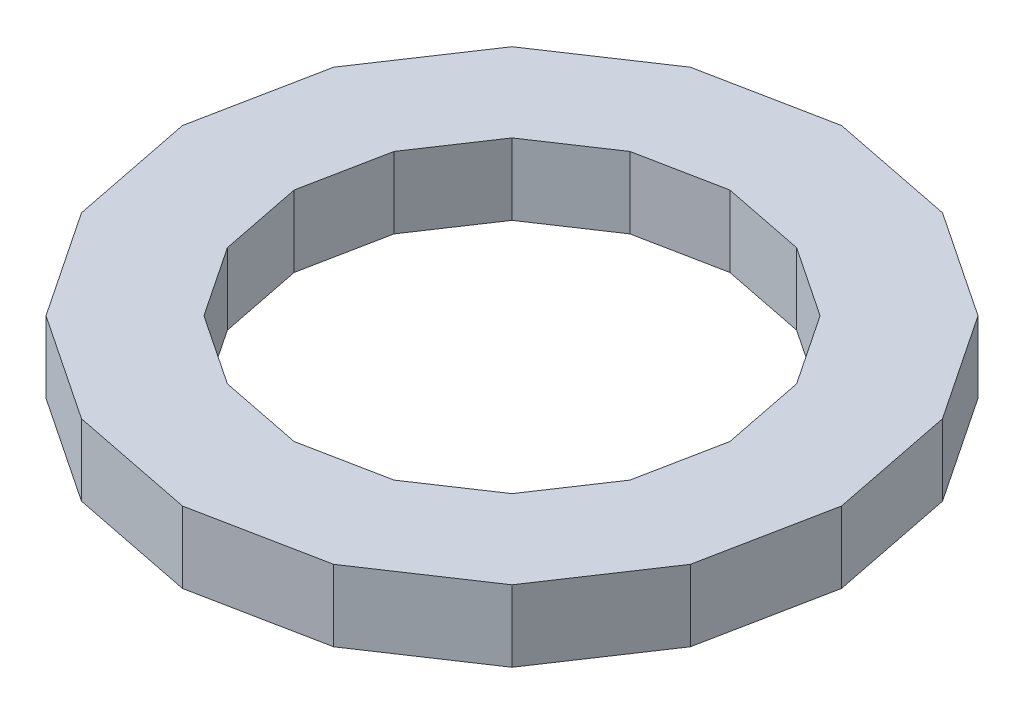
ISO-10303-21;
HEADER;
FILE_DESCRIPTION(('STEP AP214'),'2;1');
FILE_NAME('part.step','',(''),(''),'','','');
FILE_SCHEMA(('AUTOMOTIVE_DESIGN { 1 0 10303 214 1 1 1 1 }'));
ENDSEC;
DATA;
#1=APPLICATION_CONTEXT('core data for automotive mechanical design processes');
#2=APPLICATION_PROTOCOL_DEFINITION('international standard','automotive_design',2000,#1);
#3=PRODUCT_CONTEXT('',#1,'mechanical');
#4=PRODUCT('Part','Part','',(#3));
#5=PRODUCT_RELATED_PRODUCT_CATEGORY('part','',(#4));
#6=PRODUCT_DEFINITION_FORMATION('','',#4);
#7=PRODUCT_DEFINITION_CONTEXT('part definition',#1,'design');
#8=PRODUCT_DEFINITION('design','',#6,#7);
#9=PRODUCT_DEFINITION_SHAPE('','',#8);
#10=(LENGTH_UNIT() NAMED_UNIT(*) SI_UNIT(.MILLI.,.METRE.));
#11=(NAMED_UNIT(*) PLANE_ANGLE_UNIT() SI_UNIT($,.RADIAN.));
#12=(NAMED_UNIT(*) SI_UNIT($,.STERADIAN.) SOLID_ANGLE_UNIT());
#13=UNCERTAINTY_MEASURE_WITH_UNIT(LENGTH_MEASURE(1.E-05),#10,'distance_accuracy_value','');
#14=(GEOMETRIC_REPRESENTATION_CONTEXT(3) GLOBAL_UNCERTAINTY_ASSIGNED_CONTEXT((#13)) GLOBAL_UNIT_ASSIGNED_CONTEXT((#10,
#11,#12)) REPRESENTATION_CONTEXT('',''));
#15=CARTESIAN_POINT('',(0.,0.,0.));
#16=DIRECTION('',(0.,0.,1.));
#17=DIRECTION('',(1.,0.,0.));
#18=AXIS2_PLACEMENT_3D('',#15,#16,#17);
#19=CARTESIAN_POINT('',(0.,19.05,0.));
#20=DIRECTION('',(0.,1.,0.));
#21=DIRECTION('',(0.,0.,1.));
#22=AXIS2_PLACEMENT_3D('',#19,#20,#21);
#23=PLANE('',#22);
#24=DIRECTION('',(0.195090322016118,0.,-0.980785280403233));
#25=VECTOR('',#24,1.);
#26=CARTESIAN_POINT('',(81.1927235611237,19.05,33.6311272650259));
#27=LINE('',#26,#25);
#28=CARTESIAN_POINT('',(81.1927235611237,19.05,33.6311272650259));
#29=VERTEX_POINT('',#28);
#30=CARTESIAN_POINT('',(87.8823707030564,19.05,-1.01655945706168E-12));
#31=VERTEX_POINT('',#30);
#32=EDGE_CURVE('E387',#29,#31,#27,.T.);
#33=ORIENTED_EDGE('',*,*,#32,.T.);
#34=DIRECTION('',(-0.195090322016139,0.,-0.980785280403228));
#35=VECTOR('',#34,1.);
#36=CARTESIAN_POINT('',(87.8823707030564,19.05,-1.01655945706168E-12));
#37=LINE('',#36,#35);
#38=CARTESIAN_POINT('',(81.192723561123,19.05,-33.6311272650277));
#39=VERTEX_POINT('',#38);
#40=EDGE_CURVE('E391',#31,#39,#37,.T.);
#41=ORIENTED_EDGE('',*,*,#40,.T.);
#42=DIRECTION('',(-0.555570233019611,0.,-0.831469612302539));
#43=VECTOR('',#42,1.);
#44=CARTESIAN_POINT('',(81.192723561123,19.05,-33.6311272650277));
#45=LINE('',#44,#43);
#46=CARTESIAN_POINT('',(62.1422202708805,19.05,-62.1422202708819));
#47=VERTEX_POINT('',#46);
#48=EDGE_CURVE('E395',#39,#47,#45,.T.);
#49=ORIENTED_EDGE('',*,*,#48,.T.);
#50=DIRECTION('',(-0.831469612302551,0.,-0.555570233019593));
#51=VECTOR('',#50,1.);
#52=CARTESIAN_POINT('',(62.1422202708805,19.05,-62.1422202708819));
#53=LINE('',#52,#51);
#54=CARTESIAN_POINT('',(33.631127265026,19.05,-81.1927235611237));
#55=VERTEX_POINT('',#54);
#56=EDGE_CURVE('E398',#47,#55,#53,.T.);
#57=ORIENTED_EDGE('',*,*,#56,.T.);
#58=DIRECTION('',(-0.980785280403233,0.,-0.195090322016117));
#59=VECTOR('',#58,1.);
#60=CARTESIAN_POINT('',(33.631127265026,19.05,-81.1927235611237));
#61=LINE('',#60,#59);
#62=CARTESIAN_POINT('',(-9.65141768069911E-13,19.05,-87.8823707030564));
#63=VERTEX_POINT('',#62);
#64=EDGE_CURVE('E401',#55,#63,#61,.T.);
#65=ORIENTED_EDGE('',*,*,#64,.T.);
#66=DIRECTION('',(-0.980785280403228,0.,0.195090322016139));
#67=VECTOR('',#66,1.);
#68=CARTESIAN_POINT('',(-9.65141768069911E-13,19.05,-87.8823707030564));
#69=LINE('',#68,#67);
#70=CARTESIAN_POINT('',(-33.6311272650277,19.05,-81.192723561123));
#71=VERTEX_POINT('',#70);
#72=EDGE_CURVE('E404',#63,#71,#69,.T.);
#73=ORIENTED_EDGE('',*,*,#72,.T.);
#74=DIRECTION('',(-0.831469612302539,0.,0.555570233019611));
#75=VECTOR('',#74,1.);
#76=CARTESIAN_POINT('',(-33.6311272650277,19.05,-81.192723561123));
#77=LINE('',#76,#75);
#78=CARTESIAN_POINT('',(-62.1422202708818,19.05,-62.1422202708805));
#79=VERTEX_POINT('',#78);
#80=EDGE_CURVE('E406',#71,#79,#77,.T.);
#81=ORIENTED_EDGE('',*,*,#80,.T.);
#82=DIRECTION('',(-0.555570233019593,0.,0.831469612302551));
#83=VECTOR('',#82,1.);
#84=CARTESIAN_POINT('',(-62.1422202708818,19.05,-62.1422202708805));
#85=LINE('',#84,#83);
#86=CARTESIAN_POINT('',(-81.1927235611237,19.05,-33.631127265026));
#87=VERTEX_POINT('',#86);
#88=EDGE_CURVE('E408',#79,#87,#85,.T.);
#89=ORIENTED_EDGE('',*,*,#88,.T.);
#90=DIRECTION('',(-0.195090322016118,0.,0.980785280403233));
#91=VECTOR('',#90,1.);
#92=CARTESIAN_POINT('',(-81.1927235611237,19.05,-33.631127265026));
#93=LINE('',#92,#91);
#94=CARTESIAN_POINT('',(-87.8823707030564,19.05,9.20624806189212E-13));
#95=VERTEX_POINT('',#94);
#96=EDGE_CURVE('E410',#87,#95,#93,.T.);
#97=ORIENTED_EDGE('',*,*,#96,.T.);
#98=DIRECTION('',(0.195090322016139,0.,0.980785280403229));
#99=VECTOR('',#98,1.);
#100=CARTESIAN_POINT('',(-87.8823707030564,19.05,9.20624806189212E-13));
#101=LINE('',#100,#99);
#102=CARTESIAN_POINT('',(-81.192723561123,19.05,33.6311272650277));
#103=VERTEX_POINT('',#102);
#104=EDGE_CURVE('E412',#95,#103,#101,.T.);
#105=ORIENTED_EDGE('',*,*,#104,.T.);
#106=DIRECTION('',(0.555570233019611,0.,0.831469612302539));
#107=VECTOR('',#106,1.);
#108=CARTESIAN_POINT('',(-81.192723561123,19.05,33.6311272650277));
#109=LINE('',#108,#107);
#110=CARTESIAN_POINT('',(-62.1422202708805,19.05,62.1422202708818));
#111=VERTEX_POINT('',#110);
#112=EDGE_CURVE('E414',#103,#111,#109,.T.);
#113=ORIENTED_EDGE('',*,*,#112,.T.);
#114=DIRECTION('',(0.831469612302551,0.,0.555570233019593));
#115=VECTOR('',#114,1.);
#116=CARTESIAN_POINT('',(-62.1422202708805,19.05,62.1422202708818));
#117=LINE('',#116,#115);
#118=CARTESIAN_POINT('',(-33.631127265026,19.05,81.1927235611237));
#119=VERTEX_POINT('',#118);
#120=EDGE_CURVE('E416',#111,#119,#117,.T.);
#121=ORIENTED_EDGE('',*,*,#120,.T.);
#122=DIRECTION('',(0.980785280403233,0.,0.195090322016118));
#123=VECTOR('',#122,1.);
#124=CARTESIAN_POINT('',(-33.631127265026,19.05,81.1927235611237));
#125=LINE('',#124,#123);
#126=CARTESIAN_POINT('',(9.26245501704378E-13,19.05,87.8823707030564));
#127=VERTEX_POINT('',#126);
#128=EDGE_CURVE('E419',#119,#127,#125,.T.);
#129=ORIENTED_EDGE('',*,*,#128,.T.);
#130=DIRECTION('',(0.980785280403229,0.,-0.195090322016138));
#131=VECTOR('',#130,1.);
#132=CARTESIAN_POINT('',(9.26245501704378E-13,19.05,87.8823707030564));
#133=LINE('',#132,#131);
#134=CARTESIAN_POINT('',(33.6311272650277,19.05,81.192723561123));
#135=VERTEX_POINT('',#134);
#136=EDGE_CURVE('E421',#127,#135,#133,.T.);
#137=ORIENTED_EDGE('',*,*,#136,.T.);
#138=DIRECTION('',(0.831469612302539,0.,-0.555570233019611));
#139=VECTOR('',#138,1.);
#140=CARTESIAN_POINT('',(33.6311272650277,19.05,81.192723561123));
#141=LINE('',#140,#139);
#142=CARTESIAN_POINT('',(62.1422202708819,19.05,62.1422202708805));
#143=VERTEX_POINT('',#142);
#144=EDGE_CURVE('E423',#135,#143,#141,.T.);
#145=ORIENTED_EDGE('',*,*,#144,.T.);
#146=DIRECTION('',(0.555570233019593,0.,-0.831469612302551));
#147=VECTOR('',#146,1.);
#148=CARTESIAN_POINT('',(62.1422202708819,19.05,62.1422202708805));
#149=LINE('',#148,#147);
#150=EDGE_CURVE('E425',#143,#29,#149,.T.);
#151=ORIENTED_EDGE('',*,*,#150,.T.);
#152=EDGE_LOOP('',(#33,#41,#49,#57,#65,#73,#81,#89,#97,#105,#113,#121,#129,#137,#145,#151));
#153=FACE_BOUND('',#152,.T.);
#154=DIRECTION('',(-0.195090322016139,0.,-0.980785280403228));
#155=VECTOR('',#154,1.);
#156=CARTESIAN_POINT('',(58.1001129717915,19.05,-6.63183502605956E-13));
#157=LINE('',#156,#155);
#158=CARTESIAN_POINT('',(58.1001129717915,19.05,-6.63183502605956E-13));
#159=VERTEX_POINT('',#158);
#160=CARTESIAN_POINT('',(53.6775052112314,19.05,-22.2339506528452));
#161=VERTEX_POINT('',#160);
#162=EDGE_CURVE('E252',#159,#161,#157,.T.);
#163=ORIENTED_EDGE('',*,*,#162,.F.);
#164=DIRECTION('',(0.195090322016117,0.,-0.980785280403233));
#165=VECTOR('',#164,1.);
#166=CARTESIAN_POINT('',(53.6775052112319,19.05,22.233950652844));
#167=LINE('',#166,#165);
#168=CARTESIAN_POINT('',(53.6775052112319,19.05,22.233950652844));
#169=VERTEX_POINT('',#168);
#170=EDGE_CURVE('E244',#169,#159,#167,.T.);
#171=ORIENTED_EDGE('',*,*,#170,.F.);
#172=DIRECTION('',(0.555570233019593,0.,-0.831469612302551));
#173=VECTOR('',#172,1.);
#174=CARTESIAN_POINT('',(41.0829838700587,19.05,41.0829838700578));
#175=LINE('',#174,#173);
#176=CARTESIAN_POINT('',(41.0829838700587,19.05,41.0829838700578));
#177=VERTEX_POINT('',#176);
#178=EDGE_CURVE('E303',#177,#169,#175,.T.);
#179=ORIENTED_EDGE('',*,*,#178,.F.);
#180=DIRECTION('',(0.831469612302539,0.,-0.555570233019611));
#181=VECTOR('',#180,1.);
#182=CARTESIAN_POINT('',(22.2339506528452,19.05,53.6775052112314));
#183=LINE('',#182,#181);
#184=CARTESIAN_POINT('',(22.2339506528452,19.05,53.6775052112314));
#185=VERTEX_POINT('',#184);
#186=EDGE_CURVE('E300',#185,#177,#183,.T.);
#187=ORIENTED_EDGE('',*,*,#186,.F.);
#188=DIRECTION('',(0.980785280403228,0.,-0.195090322016139));
#189=VECTOR('',#188,1.);
#190=CARTESIAN_POINT('',(6.3442276878679E-13,19.05,58.1001129717914));
#191=LINE('',#190,#189);
#192=CARTESIAN_POINT('',(6.3442276878679E-13,19.05,58.1001129717914));
#193=VERTEX_POINT('',#192);
#194=EDGE_CURVE('E298',#193,#185,#191,.T.);
#195=ORIENTED_EDGE('',*,*,#194,.F.);
#196=DIRECTION('',(0.980785280403233,0.,0.195090322016118));
#197=VECTOR('',#196,1.);
#198=CARTESIAN_POINT('',(-22.233950652844,19.05,53.6775052112319));
#199=LINE('',#198,#197);
#200=CARTESIAN_POINT('',(-22.233950652844,19.05,53.6775052112319));
#201=VERTEX_POINT('',#200);
#202=EDGE_CURVE('E296',#201,#193,#199,.T.);
#203=ORIENTED_EDGE('',*,*,#202,.F.);
#204=DIRECTION('',(0.831469612302551,0.,0.555570233019593));
#205=VECTOR('',#204,1.);
#206=CARTESIAN_POINT('',(-41.0829838700578,19.05,41.0829838700587));
#207=LINE('',#206,#205);
#208=CARTESIAN_POINT('',(-41.0829838700578,19.05,41.0829838700587));
#209=VERTEX_POINT('',#208);
#210=EDGE_CURVE('E293',#209,#201,#207,.T.);
#211=ORIENTED_EDGE('',*,*,#210,.F.);
#212=DIRECTION('',(0.555570233019612,0.,0.831469612302539));
#213=VECTOR('',#212,1.);
#214=CARTESIAN_POINT('',(-53.6775052112314,19.05,22.2339506528452));
#215=LINE('',#214,#213);
#216=CARTESIAN_POINT('',(-53.6775052112314,19.05,22.2339506528452));
#217=VERTEX_POINT('',#216);
#218=EDGE_CURVE('E291',#217,#209,#215,.T.);
#219=ORIENTED_EDGE('',*,*,#218,.F.);
#220=DIRECTION('',(0.195090322016139,0.,0.980785280403228));
#221=VECTOR('',#220,1.);
#222=CARTESIAN_POINT('',(-58.1001129717914,19.05,6.38480949776965E-13));
#223=LINE('',#222,#221);
#224=CARTESIAN_POINT('',(-58.1001129717914,19.05,6.38480949776965E-13));
#225=VERTEX_POINT('',#224);
#226=EDGE_CURVE('E289',#225,#217,#223,.T.);
#227=ORIENTED_EDGE('',*,*,#226,.F.);
#228=DIRECTION('',(-0.195090322016118,0.,0.980785280403233));
#229=VECTOR('',#228,1.);
#230=CARTESIAN_POINT('',(-53.6775052112319,19.05,-22.233950652844));
#231=LINE('',#230,#229);
#232=CARTESIAN_POINT('',(-53.6775052112319,19.05,-22.233950652844));
#233=VERTEX_POINT('',#232);
#234=EDGE_CURVE('E287',#233,#225,#231,.T.);
#235=ORIENTED_EDGE('',*,*,#234,.F.);
#236=DIRECTION('',(-0.555570233019593,0.,0.831469612302551));
#237=VECTOR('',#236,1.);
#238=CARTESIAN_POINT('',(-41.0829838700587,19.05,-41.0829838700578));
#239=LINE('',#238,#237);
#240=CARTESIAN_POINT('',(-41.0829838700587,19.05,-41.0829838700578));
#241=VERTEX_POINT('',#240);
#242=EDGE_CURVE('E285',#241,#233,#239,.T.);
#243=ORIENTED_EDGE('',*,*,#242,.F.);
#244=DIRECTION('',(-0.831469612302539,0.,0.555570233019612));
#245=VECTOR('',#244,1.);
#246=CARTESIAN_POINT('',(-22.2339506528452,19.05,-53.6775052112314));
#247=LINE('',#246,#245);
#248=CARTESIAN_POINT('',(-22.2339506528452,19.05,-53.6775052112314));
#249=VERTEX_POINT('',#248);
#250=EDGE_CURVE('E283',#249,#241,#247,.T.);
#251=ORIENTED_EDGE('',*,*,#250,.F.);
#252=DIRECTION('',(-0.980785280403228,0.,0.195090322016139));
#253=VECTOR('',#252,1.);
#254=CARTESIAN_POINT('',(-6.4261974966118E-13,19.05,-58.1001129717914));
#255=LINE('',#254,#253);
#256=CARTESIAN_POINT('',(-6.4261974966118E-13,19.05,-58.1001129717914));
#257=VERTEX_POINT('',#256);
#258=EDGE_CURVE('E281',#257,#249,#255,.T.);
#259=ORIENTED_EDGE('',*,*,#258,.F.);
#260=DIRECTION('',(-0.980785280403233,0.,-0.195090322016118));
#261=VECTOR('',#260,1.);
#262=CARTESIAN_POINT('',(22.2339506528441,19.05,-53.6775052112318));
#263=LINE('',#262,#261);
#264=CARTESIAN_POINT('',(22.2339506528441,19.05,-53.6775052112318));
#265=VERTEX_POINT('',#264);
#266=EDGE_CURVE('E278',#265,#257,#263,.T.);
#267=ORIENTED_EDGE('',*,*,#266,.F.);
#268=DIRECTION('',(-0.831469612302552,0.,-0.555570233019593));
#269=VECTOR('',#268,1.);
#270=CARTESIAN_POINT('',(41.0829838700578,19.05,-41.0829838700587));
#271=LINE('',#270,#269);
#272=CARTESIAN_POINT('',(41.0829838700578,19.05,-41.0829838700587));
#273=VERTEX_POINT('',#272);
#274=EDGE_CURVE('E273',#273,#265,#271,.T.);
#275=ORIENTED_EDGE('',*,*,#274,.F.);
#276=DIRECTION('',(-0.555570233019611,0.,-0.831469612302539));
#277=VECTOR('',#276,1.);
#278=CARTESIAN_POINT('',(53.6775052112314,19.05,-22.2339506528452));
#279=LINE('',#278,#277);
#280=EDGE_CURVE('E266',#161,#273,#279,.T.);
#281=ORIENTED_EDGE('',*,*,#280,.F.);
#282=EDGE_LOOP('',(#163,#171,#179,#187,#195,#203,#211,#219,#227,#235,#243,#251,#259,#267,#275,#281));
#283=FACE_BOUND('',#282,.T.);
#284=ADVANCED_FACE('F35',(#153,#283),#23,.T.);
#285=CARTESIAN_POINT('',(0.,0.,0.));
#286=DIRECTION('',(0.,1.,0.));
#287=DIRECTION('',(0.,0.,1.));
#288=AXIS2_PLACEMENT_3D('',#285,#286,#287);
#289=PLANE('',#288);
#290=DIRECTION('',(0.195090322016118,0.,-0.980785280403233));
#291=VECTOR('',#290,1.);
#292=CARTESIAN_POINT('',(81.1927235611237,0.,33.6311272650259));
#293=LINE('',#292,#291);
#294=CARTESIAN_POINT('',(81.1927235611237,0.,33.6311272650259));
#295=VERTEX_POINT('',#294);
#296=CARTESIAN_POINT('',(87.8823707030564,0.,-1.01655945706168E-12));
#297=VERTEX_POINT('',#296);
#298=EDGE_CURVE('E261',#295,#297,#293,.T.);
#299=ORIENTED_EDGE('',*,*,#298,.F.);
#300=DIRECTION('',(0.555570233019593,0.,-0.831469612302551));
#301=VECTOR('',#300,1.);
#302=CARTESIAN_POINT('',(62.1422202708819,0.,62.1422202708805));
#303=LINE('',#302,#301);
#304=CARTESIAN_POINT('',(62.1422202708819,0.,62.1422202708805));
#305=VERTEX_POINT('',#304);
#306=EDGE_CURVE('E392',#305,#295,#303,.T.);
#307=ORIENTED_EDGE('',*,*,#306,.F.);
#308=DIRECTION('',(0.831469612302539,0.,-0.555570233019611));
#309=VECTOR('',#308,1.);
#310=CARTESIAN_POINT('',(33.6311272650277,0.,81.192723561123));
#311=LINE('',#310,#309);
#312=CARTESIAN_POINT('',(33.6311272650277,0.,81.192723561123));
#313=VERTEX_POINT('',#312);
#314=EDGE_CURVE('E467',#313,#305,#311,.T.);
#315=ORIENTED_EDGE('',*,*,#314,.F.);
#316=DIRECTION('',(0.980785280403229,0.,-0.195090322016138));
#317=VECTOR('',#316,1.);
#318=CARTESIAN_POINT('',(9.26245501704378E-13,0.,87.8823707030564));
#319=LINE('',#318,#317);
#320=CARTESIAN_POINT('',(9.26245501704378E-13,0.,87.8823707030564));
#321=VERTEX_POINT('',#320);
#322=EDGE_CURVE('E464',#321,#313,#319,.T.);
#323=ORIENTED_EDGE('',*,*,#322,.F.);
#324=DIRECTION('',(0.980785280403233,0.,0.195090322016118));
#325=VECTOR('',#324,1.);
#326=CARTESIAN_POINT('',(-33.631127265026,0.,81.1927235611237));
#327=LINE('',#326,#325);
#328=CARTESIAN_POINT('',(-33.631127265026,0.,81.1927235611237));
#329=VERTEX_POINT('',#328);
#330=EDGE_CURVE('E461',#329,#321,#327,.T.);
#331=ORIENTED_EDGE('',*,*,#330,.F.);
#332=DIRECTION('',(0.831469612302551,0.,0.555570233019593));
#333=VECTOR('',#332,1.);
#334=CARTESIAN_POINT('',(-62.1422202708805,0.,62.1422202708818));
#335=LINE('',#334,#333);
#336=CARTESIAN_POINT('',(-62.1422202708805,0.,62.1422202708818));
#337=VERTEX_POINT('',#336);
#338=EDGE_CURVE('E458',#337,#329,#335,.T.);
#339=ORIENTED_EDGE('',*,*,#338,.F.);
#340=DIRECTION('',(0.555570233019611,0.,0.831469612302539));
#341=VECTOR('',#340,1.);
#342=CARTESIAN_POINT('',(-81.192723561123,0.,33.6311272650277));
#343=LINE('',#342,#341);
#344=CARTESIAN_POINT('',(-81.192723561123,0.,33.6311272650277));
#345=VERTEX_POINT('',#344);
#346=EDGE_CURVE('E455',#345,#337,#343,.T.);
#347=ORIENTED_EDGE('',*,*,#346,.F.);
#348=DIRECTION('',(0.195090322016139,0.,0.980785280403229));
#349=VECTOR('',#348,1.);
#350=CARTESIAN_POINT('',(-87.8823707030564,0.,9.20624806189212E-13));
#351=LINE('',#350,#349);
#352=CARTESIAN_POINT('',(-87.8823707030564,0.,9.20624806189212E-13));
#353=VERTEX_POINT('',#352);
#354=EDGE_CURVE('E453',#353,#345,#351,.T.);
#355=ORIENTED_EDGE('',*,*,#354,.F.);
#356=DIRECTION('',(-0.195090322016118,0.,0.980785280403233));
#357=VECTOR('',#356,1.);
#358=CARTESIAN_POINT('',(-81.1927235611237,0.,-33.631127265026));
#359=LINE('',#358,#357);
#360=CARTESIAN_POINT('',(-81.1927235611237,0.,-33.631127265026));
#361=VERTEX_POINT('',#360);
#362=EDGE_CURVE('E450',#361,#353,#359,.T.);
#363=ORIENTED_EDGE('',*,*,#362,.F.);
#364=DIRECTION('',(-0.555570233019593,0.,0.831469612302551));
#365=VECTOR('',#364,1.);
#366=CARTESIAN_POINT('',(-62.1422202708818,0.,-62.1422202708805));
#367=LINE('',#366,#365);
#368=CARTESIAN_POINT('',(-62.1422202708818,0.,-62.1422202708805));
#369=VERTEX_POINT('',#368);
#370=EDGE_CURVE('E448',#369,#361,#367,.T.);
#371=ORIENTED_EDGE('',*,*,#370,.F.);
#372=DIRECTION('',(-0.831469612302539,0.,0.555570233019611));
#373=VECTOR('',#372,1.);
#374=CARTESIAN_POINT('',(-33.6311272650277,0.,-81.192723561123));
#375=LINE('',#374,#373);
#376=CARTESIAN_POINT('',(-33.6311272650277,0.,-81.192723561123));
#377=VERTEX_POINT('',#376);
#378=EDGE_CURVE('E446',#377,#369,#375,.T.);
#379=ORIENTED_EDGE('',*,*,#378,.F.);
#380=DIRECTION('',(-0.980785280403228,0.,0.195090322016139));
#381=VECTOR('',#380,1.);
#382=CARTESIAN_POINT('',(-9.65141768069911E-13,0.,-87.8823707030564));
#383=LINE('',#382,#381);
#384=CARTESIAN_POINT('',(-9.65141768069911E-13,0.,-87.8823707030564));
#385=VERTEX_POINT('',#384);
#386=EDGE_CURVE('E444',#385,#377,#383,.T.);
#387=ORIENTED_EDGE('',*,*,#386,.F.);
#388=DIRECTION('',(-0.980785280403233,0.,-0.195090322016117));
#389=VECTOR('',#388,1.);
#390=CARTESIAN_POINT('',(33.631127265026,0.,-81.1927235611237));
#391=LINE('',#390,#389);
#392=CARTESIAN_POINT('',(33.631127265026,0.,-81.1927235611237));
#393=VERTEX_POINT('',#392);
#394=EDGE_CURVE('E441',#393,#385,#391,.T.);
#395=ORIENTED_EDGE('',*,*,#394,.F.);
#396=DIRECTION('',(-0.831469612302551,0.,-0.555570233019593));
#397=VECTOR('',#396,1.);
#398=CARTESIAN_POINT('',(62.1422202708805,0.,-62.1422202708819));
#399=LINE('',#398,#397);
#400=CARTESIAN_POINT('',(62.1422202708805,0.,-62.1422202708819));
#401=VERTEX_POINT('',#400);
#402=EDGE_CURVE('E438',#401,#393,#399,.T.);
#403=ORIENTED_EDGE('',*,*,#402,.F.);
#404=DIRECTION('',(-0.555570233019611,0.,-0.831469612302539));
#405=VECTOR('',#404,1.);
#406=CARTESIAN_POINT('',(81.192723561123,0.,-33.6311272650277));
#407=LINE('',#406,#405);
#408=CARTESIAN_POINT('',(81.192723561123,0.,-33.6311272650277));
#409=VERTEX_POINT('',#408);
#410=EDGE_CURVE('E435',#409,#401,#407,.T.);
#411=ORIENTED_EDGE('',*,*,#410,.F.);
#412=DIRECTION('',(-0.195090322016139,0.,-0.980785280403228));
#413=VECTOR('',#412,1.);
#414=CARTESIAN_POINT('',(87.8823707030564,0.,-1.01655945706168E-12));
#415=LINE('',#414,#413);
#416=EDGE_CURVE('E432',#297,#409,#415,.T.);
#417=ORIENTED_EDGE('',*,*,#416,.F.);
#418=EDGE_LOOP('',(#299,#307,#315,#323,#331,#339,#347,#355,#363,#371,#379,#387,#395,#403,#411,#417));
#419=FACE_BOUND('',#418,.T.);
#420=DIRECTION('',(0.195090322016117,0.,-0.980785280403233));
#421=VECTOR('',#420,1.);
#422=CARTESIAN_POINT('',(53.6775052112319,0.,22.233950652844));
#423=LINE('',#422,#421);
#424=CARTESIAN_POINT('',(53.6775052112319,0.,22.233950652844));
#425=VERTEX_POINT('',#424);
#426=CARTESIAN_POINT('',(58.1001129717915,0.,-6.63183502605956E-13));
#427=VERTEX_POINT('',#426);
#428=EDGE_CURVE('E58',#425,#427,#423,.T.);
#429=ORIENTED_EDGE('',*,*,#428,.T.);
#430=DIRECTION('',(-0.195090322016139,0.,-0.980785280403228));
#431=VECTOR('',#430,1.);
#432=CARTESIAN_POINT('',(58.1001129717915,0.,-6.63183502605956E-13));
#433=LINE('',#432,#431);
#434=CARTESIAN_POINT('',(53.6775052112314,0.,-22.2339506528452));
#435=VERTEX_POINT('',#434);
#436=EDGE_CURVE('E259',#427,#435,#433,.T.);
#437=ORIENTED_EDGE('',*,*,#436,.T.);
#438=DIRECTION('',(-0.555570233019611,0.,-0.831469612302539));
#439=VECTOR('',#438,1.);
#440=CARTESIAN_POINT('',(53.6775052112314,0.,-22.2339506528452));
#441=LINE('',#440,#439);
#442=CARTESIAN_POINT('',(41.0829838700578,0.,-41.0829838700587));
#443=VERTEX_POINT('',#442);
#444=EDGE_CURVE('E310',#435,#443,#441,.T.);
#445=ORIENTED_EDGE('',*,*,#444,.T.);
#446=DIRECTION('',(-0.831469612302552,0.,-0.555570233019593));
#447=VECTOR('',#446,1.);
#448=CARTESIAN_POINT('',(41.0829838700578,0.,-41.0829838700587));
#449=LINE('',#448,#447);
#450=CARTESIAN_POINT('',(22.2339506528441,0.,-53.6775052112318));
#451=VERTEX_POINT('',#450);
#452=EDGE_CURVE('E314',#443,#451,#449,.T.);
#453=ORIENTED_EDGE('',*,*,#452,.T.);
#454=DIRECTION('',(-0.980785280403233,0.,-0.195090322016118));
#455=VECTOR('',#454,1.);
#456=CARTESIAN_POINT('',(22.2339506528441,0.,-53.6775052112318));
#457=LINE('',#456,#455);
#458=CARTESIAN_POINT('',(-6.4261974966118E-13,0.,-58.1001129717914));
#459=VERTEX_POINT('',#458);
#460=EDGE_CURVE('E318',#451,#459,#457,.T.);
#461=ORIENTED_EDGE('',*,*,#460,.T.);
#462=DIRECTION('',(-0.980785280403228,0.,0.195090322016139));
#463=VECTOR('',#462,1.);
#464=CARTESIAN_POINT('',(-6.4261974966118E-13,0.,-58.1001129717914));
#465=LINE('',#464,#463);
#466=CARTESIAN_POINT('',(-22.2339506528452,0.,-53.6775052112314));
#467=VERTEX_POINT('',#466);
#468=EDGE_CURVE('E322',#459,#467,#465,.T.);
#469=ORIENTED_EDGE('',*,*,#468,.T.);
#470=DIRECTION('',(-0.831469612302539,0.,0.555570233019612));
#471=VECTOR('',#470,1.);
#472=CARTESIAN_POINT('',(-22.2339506528452,0.,-53.6775052112314));
#473=LINE('',#472,#471);
#474=CARTESIAN_POINT('',(-41.0829838700587,0.,-41.0829838700578));
#475=VERTEX_POINT('',#474);
#476=EDGE_CURVE('E325',#467,#475,#473,.T.);
#477=ORIENTED_EDGE('',*,*,#476,.T.);
#478=DIRECTION('',(-0.555570233019593,0.,0.831469612302551));
#479=VECTOR('',#478,1.);
#480=CARTESIAN_POINT('',(-41.0829838700587,0.,-41.0829838700578));
#481=LINE('',#480,#479);
#482=CARTESIAN_POINT('',(-53.6775052112319,0.,-22.233950652844));
#483=VERTEX_POINT('',#482);
#484=EDGE_CURVE('E329',#475,#483,#481,.T.);
#485=ORIENTED_EDGE('',*,*,#484,.T.);
#486=DIRECTION('',(-0.195090322016118,0.,0.980785280403233));
#487=VECTOR('',#486,1.);
#488=CARTESIAN_POINT('',(-53.6775052112319,0.,-22.233950652844));
#489=LINE('',#488,#487);
#490=CARTESIAN_POINT('',(-58.1001129717914,0.,6.38480949776965E-13));
#491=VERTEX_POINT('',#490);
#492=EDGE_CURVE('E332',#483,#491,#489,.T.);
#493=ORIENTED_EDGE('',*,*,#492,.T.);
#494=DIRECTION('',(0.195090322016139,0.,0.980785280403228));
#495=VECTOR('',#494,1.);
#496=CARTESIAN_POINT('',(-58.1001129717914,0.,6.38480949776965E-13));
#497=LINE('',#496,#495);
#498=CARTESIAN_POINT('',(-53.6775052112314,0.,22.2339506528452));
#499=VERTEX_POINT('',#498);
#500=EDGE_CURVE('E336',#491,#499,#497,.T.);
#501=ORIENTED_EDGE('',*,*,#500,.T.);
#502=DIRECTION('',(0.555570233019612,0.,0.831469612302539));
#503=VECTOR('',#502,1.);
#504=CARTESIAN_POINT('',(-53.6775052112314,0.,22.2339506528452));
#505=LINE('',#504,#503);
#506=CARTESIAN_POINT('',(-41.0829838700578,0.,41.0829838700587));
#507=VERTEX_POINT('',#506);
#508=EDGE_CURVE('E339',#499,#507,#505,.T.);
#509=ORIENTED_EDGE('',*,*,#508,.T.);
#510=DIRECTION('',(0.831469612302551,0.,0.555570233019593));
#511=VECTOR('',#510,1.);
#512=CARTESIAN_POINT('',(-41.0829838700578,0.,41.0829838700587));
#513=LINE('',#512,#511);
#514=CARTESIAN_POINT('',(-22.233950652844,0.,53.6775052112319));
#515=VERTEX_POINT('',#514);
#516=EDGE_CURVE('E343',#507,#515,#513,.T.);
#517=ORIENTED_EDGE('',*,*,#516,.T.);
#518=DIRECTION('',(0.980785280403233,0.,0.195090322016118));
#519=VECTOR('',#518,1.);
#520=CARTESIAN_POINT('',(-22.233950652844,0.,53.6775052112319));
#521=LINE('',#520,#519);
#522=CARTESIAN_POINT('',(6.3442276878679E-13,0.,58.1001129717914));
#523=VERTEX_POINT('',#522);
#524=EDGE_CURVE('E346',#515,#523,#521,.T.);
#525=ORIENTED_EDGE('',*,*,#524,.T.);
#526=DIRECTION('',(0.980785280403228,0.,-0.195090322016139));
#527=VECTOR('',#526,1.);
#528=CARTESIAN_POINT('',(6.3442276878679E-13,0.,58.1001129717914));
#529=LINE('',#528,#527);
#530=CARTESIAN_POINT('',(22.2339506528452,0.,53.6775052112314));
#531=VERTEX_POINT('',#530);
#532=EDGE_CURVE('E349',#523,#531,#529,.T.);
#533=ORIENTED_EDGE('',*,*,#532,.T.);
#534=DIRECTION('',(0.831469612302539,0.,-0.555570233019611));
#535=VECTOR('',#534,1.);
#536=CARTESIAN_POINT('',(22.2339506528452,0.,53.6775052112314));
#537=LINE('',#536,#535);
#538=CARTESIAN_POINT('',(41.0829838700587,0.,41.0829838700578));
#539=VERTEX_POINT('',#538);
#540=EDGE_CURVE('E352',#531,#539,#537,.T.);
#541=ORIENTED_EDGE('',*,*,#540,.T.);
#542=DIRECTION('',(0.555570233019593,0.,-0.831469612302551));
#543=VECTOR('',#542,1.);
#544=CARTESIAN_POINT('',(41.0829838700587,0.,41.0829838700578));
#545=LINE('',#544,#543);
#546=EDGE_CURVE('E253',#539,#425,#545,.T.);
#547=ORIENTED_EDGE('',*,*,#546,.T.);
#548=EDGE_LOOP('',(#429,#437,#445,#453,#461,#469,#477,#485,#493,#501,#509,#517,#525,#533,#541,#547));
#549=FACE_BOUND('',#548,.T.);
#550=ADVANCED_FACE('F529',(#419,#549),#289,.F.);
#551=CARTESIAN_POINT('',(81.1927235611237,19.05,33.6311272650259));
#552=DIRECTION('',(-0.980785280403232,0.,-0.195090322016118));
#553=DIRECTION('',(-0.195090322016118,0.,0.980785280403233));
#554=AXIS2_PLACEMENT_3D('',#551,#552,#553);
#555=PLANE('',#554);
#556=ORIENTED_EDGE('',*,*,#298,.T.);
#557=DIRECTION('',(0.,-1.,0.));
#558=VECTOR('',#557,1.);
#559=CARTESIAN_POINT('',(87.8823707030564,19.05,-1.01655945706168E-12));
#560=LINE('',#559,#558);
#561=EDGE_CURVE('E11',#31,#297,#560,.T.);
#562=ORIENTED_EDGE('',*,*,#561,.F.);
#563=ORIENTED_EDGE('',*,*,#32,.F.);
#564=DIRECTION('',(0.,-1.,0.));
#565=VECTOR('',#564,1.);
#566=CARTESIAN_POINT('',(81.1927235611237,19.05,33.6311272650259));
#567=LINE('',#566,#565);
#568=EDGE_CURVE('E428',#29,#295,#567,.T.);
#569=ORIENTED_EDGE('',*,*,#568,.T.);
#570=EDGE_LOOP('',(#556,#562,#563,#569));
#571=FACE_BOUND('',#570,.T.);
#572=ADVANCED_FACE('F37',(#571),#555,.F.);
#573=CARTESIAN_POINT('',(87.8823707030564,19.05,-1.01655945706168E-12));
#574=DIRECTION('',(-0.980785280403228,0.,0.195090322016139));
#575=DIRECTION('',(0.195090322016139,0.,0.980785280403228));
#576=AXIS2_PLACEMENT_3D('',#573,#574,#575);
#577=PLANE('',#576);
#578=ORIENTED_EDGE('',*,*,#416,.T.);
#579=DIRECTION('',(0.,-1.,0.));
#580=VECTOR('',#579,1.);
#581=CARTESIAN_POINT('',(81.192723561123,19.05,-33.6311272650277));
#582=LINE('',#581,#580);
#583=EDGE_CURVE('E43',#39,#409,#582,.T.);
#584=ORIENTED_EDGE('',*,*,#583,.F.);
#585=ORIENTED_EDGE('',*,*,#40,.F.);
#586=ORIENTED_EDGE('',*,*,#561,.T.);
#587=EDGE_LOOP('',(#578,#584,#585,#586));
#588=FACE_BOUND('',#587,.T.);
#589=ADVANCED_FACE('F546',(#588),#577,.F.);
#590=CARTESIAN_POINT('',(81.192723561123,19.05,-33.6311272650277));
#591=DIRECTION('',(-0.831469612302539,0.,0.555570233019611));
#592=DIRECTION('',(0.555570233019611,0.,0.831469612302539));
#593=AXIS2_PLACEMENT_3D('',#590,#591,#592);
#594=PLANE('',#593);
#595=ORIENTED_EDGE('',*,*,#410,.T.);
#596=DIRECTION('',(0.,-1.,0.));
#597=VECTOR('',#596,1.);
#598=CARTESIAN_POINT('',(62.1422202708805,19.05,-62.1422202708819));
#599=LINE('',#598,#597);
#600=EDGE_CURVE('E512',#47,#401,#599,.T.);
#601=ORIENTED_EDGE('',*,*,#600,.F.);
#602=ORIENTED_EDGE('',*,*,#48,.F.);
#603=ORIENTED_EDGE('',*,*,#583,.T.);
#604=EDGE_LOOP('',(#595,#601,#602,#603));
#605=FACE_BOUND('',#604,.T.);
#606=ADVANCED_FACE('F523',(#605),#594,.F.);
#607=CARTESIAN_POINT('',(62.1422202708805,19.05,-62.1422202708819));
#608=DIRECTION('',(-0.555570233019593,0.,0.831469612302552));
#609=DIRECTION('',(0.831469612302552,0.,0.555570233019593));
#610=AXIS2_PLACEMENT_3D('',#607,#608,#609);
#611=PLANE('',#610);
#612=ORIENTED_EDGE('',*,*,#402,.T.);
#613=DIRECTION('',(0.,-1.,0.));
#614=VECTOR('',#613,1.);
#615=CARTESIAN_POINT('',(33.631127265026,19.05,-81.1927235611237));
#616=LINE('',#615,#614);
#617=EDGE_CURVE('E508',#55,#393,#616,.T.);
#618=ORIENTED_EDGE('',*,*,#617,.F.);
#619=ORIENTED_EDGE('',*,*,#56,.F.);
#620=ORIENTED_EDGE('',*,*,#600,.T.);
#621=EDGE_LOOP('',(#612,#618,#619,#620));
#622=FACE_BOUND('',#621,.T.);
#623=ADVANCED_FACE('F535',(#622),#611,.F.);
#624=CARTESIAN_POINT('',(33.631127265026,19.05,-81.1927235611237));
#625=DIRECTION('',(-0.195090322016117,0.,0.980785280403233));
#626=DIRECTION('',(0.980785280403233,0.,0.195090322016117));
#627=AXIS2_PLACEMENT_3D('',#624,#625,#626);
#628=PLANE('',#627);
#629=ORIENTED_EDGE('',*,*,#394,.T.);
#630=DIRECTION('',(0.,-1.,0.));
#631=VECTOR('',#630,1.);
#632=CARTESIAN_POINT('',(-9.65141768069911E-13,19.05,-87.8823707030564));
#633=LINE('',#632,#631);
#634=EDGE_CURVE('E505',#63,#385,#633,.T.);
#635=ORIENTED_EDGE('',*,*,#634,.F.);
#636=ORIENTED_EDGE('',*,*,#64,.F.);
#637=ORIENTED_EDGE('',*,*,#617,.T.);
#638=EDGE_LOOP('',(#629,#635,#636,#637));
#639=FACE_BOUND('',#638,.T.);
#640=ADVANCED_FACE('F539',(#639),#628,.F.);
#641=CARTESIAN_POINT('',(-9.65141768069911E-13,19.05,-87.8823707030564));
#642=DIRECTION('',(0.195090322016139,0.,0.980785280403228));
#643=DIRECTION('',(0.980785280403228,0.,-0.195090322016139));
#644=AXIS2_PLACEMENT_3D('',#641,#642,#643);
#645=PLANE('',#644);
#646=ORIENTED_EDGE('',*,*,#386,.T.);
#647=DIRECTION('',(0.,-1.,0.));
#648=VECTOR('',#647,1.);
#649=CARTESIAN_POINT('',(-33.6311272650277,19.05,-81.192723561123));
#650=LINE('',#649,#648);
#651=EDGE_CURVE('E502',#71,#377,#650,.T.);
#652=ORIENTED_EDGE('',*,*,#651,.F.);
#653=ORIENTED_EDGE('',*,*,#72,.F.);
#654=ORIENTED_EDGE('',*,*,#634,.T.);
#655=EDGE_LOOP('',(#646,#652,#653,#654));
#656=FACE_BOUND('',#655,.T.);
#657=ADVANCED_FACE('F599',(#656),#645,.F.);
#658=CARTESIAN_POINT('',(-33.6311272650277,19.05,-81.192723561123));
#659=DIRECTION('',(0.555570233019611,0.,0.831469612302539));
#660=DIRECTION('',(0.831469612302539,0.,-0.555570233019611));
#661=AXIS2_PLACEMENT_3D('',#658,#659,#660);
#662=PLANE('',#661);
#663=ORIENTED_EDGE('',*,*,#378,.T.);
#664=DIRECTION('',(0.,-1.,0.));
#665=VECTOR('',#664,1.);
#666=CARTESIAN_POINT('',(-62.1422202708818,19.05,-62.1422202708805));
#667=LINE('',#666,#665);
#668=EDGE_CURVE('E499',#79,#369,#667,.T.);
#669=ORIENTED_EDGE('',*,*,#668,.F.);
#670=ORIENTED_EDGE('',*,*,#80,.F.);
#671=ORIENTED_EDGE('',*,*,#651,.T.);
#672=EDGE_LOOP('',(#663,#669,#670,#671));
#673=FACE_BOUND('',#672,.T.);
#674=ADVANCED_FACE('F596',(#673),#662,.F.);
#675=CARTESIAN_POINT('',(-62.1422202708818,19.05,-62.1422202708805));
#676=DIRECTION('',(0.831469612302551,0.,0.555570233019593));
#677=DIRECTION('',(0.555570233019593,0.,-0.831469612302551));
#678=AXIS2_PLACEMENT_3D('',#675,#676,#677);
#679=PLANE('',#678);
#680=ORIENTED_EDGE('',*,*,#370,.T.);
#681=DIRECTION('',(0.,-1.,0.));
#682=VECTOR('',#681,1.);
#683=CARTESIAN_POINT('',(-81.1927235611237,19.05,-33.631127265026));
#684=LINE('',#683,#682);
#685=EDGE_CURVE('E496',#87,#361,#684,.T.);
#686=ORIENTED_EDGE('',*,*,#685,.F.);
#687=ORIENTED_EDGE('',*,*,#88,.F.);
#688=ORIENTED_EDGE('',*,*,#668,.T.);
#689=EDGE_LOOP('',(#680,#686,#687,#688));
#690=FACE_BOUND('',#689,.T.);
#691=ADVANCED_FACE('F592',(#690),#679,.F.);
#692=CARTESIAN_POINT('',(-81.1927235611237,19.05,-33.631127265026));
#693=DIRECTION('',(0.980785280403233,0.,0.195090322016118));
#694=DIRECTION('',(0.195090322016118,0.,-0.980785280403233));
#695=AXIS2_PLACEMENT_3D('',#692,#693,#694);
#696=PLANE('',#695);
#697=ORIENTED_EDGE('',*,*,#362,.T.);
#698=DIRECTION('',(0.,-1.,0.));
#699=VECTOR('',#698,1.);
#700=CARTESIAN_POINT('',(-87.8823707030564,19.05,9.20624806189212E-13));
#701=LINE('',#700,#699);
#702=EDGE_CURVE('E493',#95,#353,#701,.T.);
#703=ORIENTED_EDGE('',*,*,#702,.F.);
#704=ORIENTED_EDGE('',*,*,#96,.F.);
#705=ORIENTED_EDGE('',*,*,#685,.T.);
#706=EDGE_LOOP('',(#697,#703,#704,#705));
#707=FACE_BOUND('',#706,.T.);
#708=ADVANCED_FACE('F588',(#707),#696,.F.);
#709=CARTESIAN_POINT('',(-87.8823707030564,19.05,9.20624806189212E-13));
#710=DIRECTION('',(0.980785280403228,0.,-0.195090322016139));
#711=DIRECTION('',(-0.195090322016139,0.,-0.980785280403228));
#712=AXIS2_PLACEMENT_3D('',#709,#710,#711);
#713=PLANE('',#712);
#714=ORIENTED_EDGE('',*,*,#354,.T.);
#715=DIRECTION('',(0.,-1.,0.));
#716=VECTOR('',#715,1.);
#717=CARTESIAN_POINT('',(-81.192723561123,19.05,33.6311272650277));
#718=LINE('',#717,#716);
#719=EDGE_CURVE('E490',#103,#345,#718,.T.);
#720=ORIENTED_EDGE('',*,*,#719,.F.);
#721=ORIENTED_EDGE('',*,*,#104,.F.);
#722=ORIENTED_EDGE('',*,*,#702,.T.);
#723=EDGE_LOOP('',(#714,#720,#721,#722));
#724=FACE_BOUND('',#723,.T.);
#725=ADVANCED_FACE('F583',(#724),#713,.F.);
#726=CARTESIAN_POINT('',(-81.192723561123,19.05,33.6311272650277));
#727=DIRECTION('',(0.831469612302539,0.,-0.555570233019611));
#728=DIRECTION('',(-0.555570233019611,0.,-0.831469612302539));
#729=AXIS2_PLACEMENT_3D('',#726,#727,#728);
#730=PLANE('',#729);
#731=ORIENTED_EDGE('',*,*,#346,.T.);
#732=DIRECTION('',(0.,-1.,0.));
#733=VECTOR('',#732,1.);
#734=CARTESIAN_POINT('',(-62.1422202708805,19.05,62.1422202708818));
#735=LINE('',#734,#733);
#736=EDGE_CURVE('E486',#111,#337,#735,.T.);
#737=ORIENTED_EDGE('',*,*,#736,.F.);
#738=ORIENTED_EDGE('',*,*,#112,.F.);
#739=ORIENTED_EDGE('',*,*,#719,.T.);
#740=EDGE_LOOP('',(#731,#737,#738,#739));
#741=FACE_BOUND('',#740,.T.);
#742=ADVANCED_FACE('F577',(#741),#730,.F.);
#743=CARTESIAN_POINT('',(-62.1422202708805,19.05,62.1422202708818));
#744=DIRECTION('',(0.555570233019593,0.,-0.831469612302551));
#745=DIRECTION('',(-0.831469612302551,0.,-0.555570233019593));
#746=AXIS2_PLACEMENT_3D('',#743,#744,#745);
#747=PLANE('',#746);
#748=ORIENTED_EDGE('',*,*,#338,.T.);
#749=DIRECTION('',(0.,-1.,0.));
#750=VECTOR('',#749,1.);
#751=CARTESIAN_POINT('',(-33.631127265026,19.05,81.1927235611237));
#752=LINE('',#751,#750);
#753=EDGE_CURVE('E482',#119,#329,#752,.T.);
#754=ORIENTED_EDGE('',*,*,#753,.F.);
#755=ORIENTED_EDGE('',*,*,#120,.F.);
#756=ORIENTED_EDGE('',*,*,#736,.T.);
#757=EDGE_LOOP('',(#748,#754,#755,#756));
#758=FACE_BOUND('',#757,.T.);
#759=ADVANCED_FACE('F573',(#758),#747,.F.);
#760=CARTESIAN_POINT('',(-33.631127265026,19.05,81.1927235611237));
#761=DIRECTION('',(0.195090322016118,0.,-0.980785280403233));
#762=DIRECTION('',(-0.980785280403233,0.,-0.195090322016118));
#763=AXIS2_PLACEMENT_3D('',#760,#761,#762);
#764=PLANE('',#763);
#765=ORIENTED_EDGE('',*,*,#330,.T.);
#766=DIRECTION('',(0.,-1.,0.));
#767=VECTOR('',#766,1.);
#768=CARTESIAN_POINT('',(9.26245501704378E-13,19.05,87.8823707030564));
#769=LINE('',#768,#767);
#770=EDGE_CURVE('E479',#127,#321,#769,.T.);
#771=ORIENTED_EDGE('',*,*,#770,.F.);
#772=ORIENTED_EDGE('',*,*,#128,.F.);
#773=ORIENTED_EDGE('',*,*,#753,.T.);
#774=EDGE_LOOP('',(#765,#771,#772,#773));
#775=FACE_BOUND('',#774,.T.);
#776=ADVANCED_FACE('F568',(#775),#764,.F.);
#777=CARTESIAN_POINT('',(9.26245501704378E-13,19.05,87.8823707030564));
#778=DIRECTION('',(-0.195090322016138,0.,-0.980785280403228));
#779=DIRECTION('',(-0.980785280403229,0.,0.195090322016138));
#780=AXIS2_PLACEMENT_3D('',#777,#778,#779);
#781=PLANE('',#780);
#782=ORIENTED_EDGE('',*,*,#322,.T.);
#783=DIRECTION('',(0.,-1.,0.));
#784=VECTOR('',#783,1.);
#785=CARTESIAN_POINT('',(33.6311272650277,19.05,81.192723561123));
#786=LINE('',#785,#784);
#787=EDGE_CURVE('E476',#135,#313,#786,.T.);
#788=ORIENTED_EDGE('',*,*,#787,.F.);
#789=ORIENTED_EDGE('',*,*,#136,.F.);
#790=ORIENTED_EDGE('',*,*,#770,.T.);
#791=EDGE_LOOP('',(#782,#788,#789,#790));
#792=FACE_BOUND('',#791,.T.);
#793=ADVANCED_FACE('F562',(#792),#781,.F.);
#794=CARTESIAN_POINT('',(33.6311272650277,19.05,81.192723561123));
#795=DIRECTION('',(-0.555570233019611,0.,-0.831469612302539));
#796=DIRECTION('',(-0.831469612302539,0.,0.555570233019611));
#797=AXIS2_PLACEMENT_3D('',#794,#795,#796);
#798=PLANE('',#797);
#799=ORIENTED_EDGE('',*,*,#314,.T.);
#800=DIRECTION('',(0.,-1.,0.));
#801=VECTOR('',#800,1.);
#802=CARTESIAN_POINT('',(62.1422202708819,19.05,62.1422202708805));
#803=LINE('',#802,#801);
#804=EDGE_CURVE('E473',#143,#305,#803,.T.);
#805=ORIENTED_EDGE('',*,*,#804,.F.);
#806=ORIENTED_EDGE('',*,*,#144,.F.);
#807=ORIENTED_EDGE('',*,*,#787,.T.);
#808=EDGE_LOOP('',(#799,#805,#806,#807));
#809=FACE_BOUND('',#808,.T.);
#810=ADVANCED_FACE('F558',(#809),#798,.F.);
#811=CARTESIAN_POINT('',(62.1422202708819,19.05,62.1422202708805));
#812=DIRECTION('',(-0.831469612302551,0.,-0.555570233019593));
#813=DIRECTION('',(-0.555570233019593,0.,0.831469612302551));
#814=AXIS2_PLACEMENT_3D('',#811,#812,#813);
#815=PLANE('',#814);
#816=ORIENTED_EDGE('',*,*,#306,.T.);
#817=ORIENTED_EDGE('',*,*,#568,.F.);
#818=ORIENTED_EDGE('',*,*,#150,.F.);
#819=ORIENTED_EDGE('',*,*,#804,.T.);
#820=EDGE_LOOP('',(#816,#817,#818,#819));
#821=FACE_BOUND('',#820,.T.);
#822=ADVANCED_FACE('F553',(#821),#815,.F.);
#823=CARTESIAN_POINT('',(53.6775052112319,19.05,22.233950652844));
#824=DIRECTION('',(-0.980785280403233,0.,-0.195090322016117));
#825=DIRECTION('',(-0.195090322016117,0.,0.980785280403233));
#826=AXIS2_PLACEMENT_3D('',#823,#824,#825);
#827=PLANE('',#826);
#828=ORIENTED_EDGE('',*,*,#428,.F.);
#829=DIRECTION('',(0.,-1.,0.));
#830=VECTOR('',#829,1.);
#831=CARTESIAN_POINT('',(53.6775052112319,19.05,22.233950652844));
#832=LINE('',#831,#830);
#833=EDGE_CURVE('E248',#169,#425,#832,.T.);
#834=ORIENTED_EDGE('',*,*,#833,.F.);
#835=ORIENTED_EDGE('',*,*,#170,.T.);
#836=DIRECTION('',(0.,-1.,0.));
#837=VECTOR('',#836,1.);
#838=CARTESIAN_POINT('',(58.1001129717915,19.05,-6.63183502605956E-13));
#839=LINE('',#838,#837);
#840=EDGE_CURVE('E247',#159,#427,#839,.T.);
#841=ORIENTED_EDGE('',*,*,#840,.T.);
#842=EDGE_LOOP('',(#828,#834,#835,#841));
#843=FACE_BOUND('',#842,.T.);
#844=ADVANCED_FACE('F246',(#843),#827,.T.);
#845=CARTESIAN_POINT('',(58.1001129717915,19.05,-6.63183502605956E-13));
#846=DIRECTION('',(-0.980785280403228,0.,0.195090322016139));
#847=DIRECTION('',(0.195090322016139,0.,0.980785280403228));
#848=AXIS2_PLACEMENT_3D('',#845,#846,#847);
#849=PLANE('',#848);
#850=ORIENTED_EDGE('',*,*,#436,.F.);
#851=ORIENTED_EDGE('',*,*,#840,.F.);
#852=ORIENTED_EDGE('',*,*,#162,.T.);
#853=DIRECTION('',(0.,-1.,0.));
#854=VECTOR('',#853,1.);
#855=CARTESIAN_POINT('',(53.6775052112314,19.05,-22.2339506528452));
#856=LINE('',#855,#854);
#857=EDGE_CURVE('E262',#161,#435,#856,.T.);
#858=ORIENTED_EDGE('',*,*,#857,.T.);
#859=EDGE_LOOP('',(#850,#851,#852,#858));
#860=FACE_BOUND('',#859,.T.);
#861=ADVANCED_FACE('F256',(#860),#849,.T.);
#862=CARTESIAN_POINT('',(53.6775052112314,19.05,-22.2339506528452));
#863=DIRECTION('',(-0.831469612302539,0.,0.555570233019611));
#864=DIRECTION('',(0.555570233019611,0.,0.831469612302539));
#865=AXIS2_PLACEMENT_3D('',#862,#863,#864);
#866=PLANE('',#865);
#867=ORIENTED_EDGE('',*,*,#444,.F.);
#868=ORIENTED_EDGE('',*,*,#857,.F.);
#869=ORIENTED_EDGE('',*,*,#280,.T.);
#870=DIRECTION('',(0.,-1.,0.));
#871=VECTOR('',#870,1.);
#872=CARTESIAN_POINT('',(41.0829838700578,19.05,-41.0829838700587));
#873=LINE('',#872,#871);
#874=EDGE_CURVE('E383',#273,#443,#873,.T.);
#875=ORIENTED_EDGE('',*,*,#874,.T.);
#876=EDGE_LOOP('',(#867,#868,#869,#875));
#877=FACE_BOUND('',#876,.T.);
#878=ADVANCED_FACE('F681',(#877),#866,.T.);
#879=CARTESIAN_POINT('',(41.0829838700578,19.05,-41.0829838700587));
#880=DIRECTION('',(-0.555570233019593,0.,0.831469612302552));
#881=DIRECTION('',(0.831469612302552,0.,0.555570233019593));
#882=AXIS2_PLACEMENT_3D('',#879,#880,#881);
#883=PLANE('',#882);
#884=ORIENTED_EDGE('',*,*,#452,.F.);
#885=ORIENTED_EDGE('',*,*,#874,.F.);
#886=ORIENTED_EDGE('',*,*,#274,.T.);
#887=DIRECTION('',(0.,-1.,0.));
#888=VECTOR('',#887,1.);
#889=CARTESIAN_POINT('',(22.2339506528441,19.05,-53.6775052112318));
#890=LINE('',#889,#888);
#891=EDGE_CURVE('E381',#265,#451,#890,.T.);
#892=ORIENTED_EDGE('',*,*,#891,.T.);
#893=EDGE_LOOP('',(#884,#885,#886,#892));
#894=FACE_BOUND('',#893,.T.);
#895=ADVANCED_FACE('F687',(#894),#883,.T.);
#896=CARTESIAN_POINT('',(22.2339506528441,19.05,-53.6775052112318));
#897=DIRECTION('',(-0.195090322016118,0.,0.980785280403233));
#898=DIRECTION('',(0.980785280403233,0.,0.195090322016118));
#899=AXIS2_PLACEMENT_3D('',#896,#897,#898);
#900=PLANE('',#899);
#901=ORIENTED_EDGE('',*,*,#460,.F.);
#902=ORIENTED_EDGE('',*,*,#891,.F.);
#903=ORIENTED_EDGE('',*,*,#266,.T.);
#904=DIRECTION('',(0.,-1.,0.));
#905=VECTOR('',#904,1.);
#906=CARTESIAN_POINT('',(-6.4261974966118E-13,19.05,-58.1001129717914));
#907=LINE('',#906,#905);
#908=EDGE_CURVE('E379',#257,#459,#907,.T.);
#909=ORIENTED_EDGE('',*,*,#908,.T.);
#910=EDGE_LOOP('',(#901,#902,#903,#909));
#911=FACE_BOUND('',#910,.T.);
#912=ADVANCED_FACE('F695',(#911),#900,.T.);
#913=CARTESIAN_POINT('',(-6.4261974966118E-13,19.05,-58.1001129717914));
#914=DIRECTION('',(0.195090322016139,0.,0.980785280403228));
#915=DIRECTION('',(0.980785280403228,0.,-0.195090322016139));
#916=AXIS2_PLACEMENT_3D('',#913,#914,#915);
#917=PLANE('',#916);
#918=ORIENTED_EDGE('',*,*,#468,.F.);
#919=ORIENTED_EDGE('',*,*,#908,.F.);
#920=ORIENTED_EDGE('',*,*,#258,.T.);
#921=DIRECTION('',(0.,-1.,0.));
#922=VECTOR('',#921,1.);
#923=CARTESIAN_POINT('',(-22.2339506528452,19.05,-53.6775052112314));
#924=LINE('',#923,#922);
#925=EDGE_CURVE('E377',#249,#467,#924,.T.);
#926=ORIENTED_EDGE('',*,*,#925,.T.);
#927=EDGE_LOOP('',(#918,#919,#920,#926));
#928=FACE_BOUND('',#927,.T.);
#929=ADVANCED_FACE('F704',(#928),#917,.T.);
#930=CARTESIAN_POINT('',(-22.2339506528452,19.05,-53.6775052112314));
#931=DIRECTION('',(0.555570233019612,0.,0.831469612302539));
#932=DIRECTION('',(0.831469612302539,0.,-0.555570233019612));
#933=AXIS2_PLACEMENT_3D('',#930,#931,#932);
#934=PLANE('',#933);
#935=ORIENTED_EDGE('',*,*,#476,.F.);
#936=ORIENTED_EDGE('',*,*,#925,.F.);
#937=ORIENTED_EDGE('',*,*,#250,.T.);
#938=DIRECTION('',(0.,-1.,0.));
#939=VECTOR('',#938,1.);
#940=CARTESIAN_POINT('',(-41.0829838700587,19.05,-41.0829838700578));
#941=LINE('',#940,#939);
#942=EDGE_CURVE('E375',#241,#475,#941,.T.);
#943=ORIENTED_EDGE('',*,*,#942,.T.);
#944=EDGE_LOOP('',(#935,#936,#937,#943));
#945=FACE_BOUND('',#944,.T.);
#946=ADVANCED_FACE('F711',(#945),#934,.T.);
#947=CARTESIAN_POINT('',(-41.0829838700587,19.05,-41.0829838700578));
#948=DIRECTION('',(0.831469612302551,0.,0.555570233019593));
#949=DIRECTION('',(0.555570233019593,0.,-0.831469612302551));
#950=AXIS2_PLACEMENT_3D('',#947,#948,#949);
#951=PLANE('',#950);
#952=ORIENTED_EDGE('',*,*,#484,.F.);
#953=ORIENTED_EDGE('',*,*,#942,.F.);
#954=ORIENTED_EDGE('',*,*,#242,.T.);
#955=DIRECTION('',(0.,-1.,0.));
#956=VECTOR('',#955,1.);
#957=CARTESIAN_POINT('',(-53.6775052112319,19.05,-22.233950652844));
#958=LINE('',#957,#956);
#959=EDGE_CURVE('E373',#233,#483,#958,.T.);
#960=ORIENTED_EDGE('',*,*,#959,.T.);
#961=EDGE_LOOP('',(#952,#953,#954,#960));
#962=FACE_BOUND('',#961,.T.);
#963=ADVANCED_FACE('F719',(#962),#951,.T.);
#964=CARTESIAN_POINT('',(-53.6775052112319,19.05,-22.233950652844));
#965=DIRECTION('',(0.980785280403233,0.,0.195090322016118));
#966=DIRECTION('',(0.195090322016118,0.,-0.980785280403233));
#967=AXIS2_PLACEMENT_3D('',#964,#965,#966);
#968=PLANE('',#967);
#969=ORIENTED_EDGE('',*,*,#492,.F.);
#970=ORIENTED_EDGE('',*,*,#959,.F.);
#971=ORIENTED_EDGE('',*,*,#234,.T.);
#972=DIRECTION('',(0.,-1.,0.));
#973=VECTOR('',#972,1.);
#974=CARTESIAN_POINT('',(-58.1001129717914,19.05,6.38480949776965E-13));
#975=LINE('',#974,#973);
#976=EDGE_CURVE('E371',#225,#491,#975,.T.);
#977=ORIENTED_EDGE('',*,*,#976,.T.);
#978=EDGE_LOOP('',(#969,#970,#971,#977));
#979=FACE_BOUND('',#978,.T.);
#980=ADVANCED_FACE('F727',(#979),#968,.T.);
#981=CARTESIAN_POINT('',(-58.1001129717914,19.05,6.38480949776965E-13));
#982=DIRECTION('',(0.980785280403228,0.,-0.195090322016139));
#983=DIRECTION('',(-0.195090322016139,0.,-0.980785280403229));
#984=AXIS2_PLACEMENT_3D('',#981,#982,#983);
#985=PLANE('',#984);
#986=ORIENTED_EDGE('',*,*,#500,.F.);
#987=ORIENTED_EDGE('',*,*,#976,.F.);
#988=ORIENTED_EDGE('',*,*,#226,.T.);
#989=DIRECTION('',(0.,-1.,0.));
#990=VECTOR('',#989,1.);
#991=CARTESIAN_POINT('',(-53.6775052112314,19.05,22.2339506528452));
#992=LINE('',#991,#990);
#993=EDGE_CURVE('E369',#217,#499,#992,.T.);
#994=ORIENTED_EDGE('',*,*,#993,.T.);
#995=EDGE_LOOP('',(#986,#987,#988,#994));
#996=FACE_BOUND('',#995,.T.);
#997=ADVANCED_FACE('F734',(#996),#985,.T.);
#998=CARTESIAN_POINT('',(-53.6775052112314,19.05,22.2339506528452));
#999=DIRECTION('',(0.831469612302539,0.,-0.555570233019612));
#1000=DIRECTION('',(-0.555570233019612,0.,-0.831469612302539));
#1001=AXIS2_PLACEMENT_3D('',#998,#999,#1000);
#1002=PLANE('',#1001);
#1003=ORIENTED_EDGE('',*,*,#508,.F.);
#1004=ORIENTED_EDGE('',*,*,#993,.F.);
#1005=ORIENTED_EDGE('',*,*,#218,.T.);
#1006=DIRECTION('',(0.,-1.,0.));
#1007=VECTOR('',#1006,1.);
#1008=CARTESIAN_POINT('',(-41.0829838700578,19.05,41.0829838700587));
#1009=LINE('',#1008,#1007);
#1010=EDGE_CURVE('E367',#209,#507,#1009,.T.);
#1011=ORIENTED_EDGE('',*,*,#1010,.T.);
#1012=EDGE_LOOP('',(#1003,#1004,#1005,#1011));
#1013=FACE_BOUND('',#1012,.T.);
#1014=ADVANCED_FACE('F742',(#1013),#1002,.T.);
#1015=CARTESIAN_POINT('',(-41.0829838700578,19.05,41.0829838700587));
#1016=DIRECTION('',(0.555570233019593,0.,-0.831469612302551));
#1017=DIRECTION('',(-0.831469612302551,0.,-0.555570233019593));
#1018=AXIS2_PLACEMENT_3D('',#1015,#1016,#1017);
#1019=PLANE('',#1018);
#1020=ORIENTED_EDGE('',*,*,#516,.F.);
#1021=ORIENTED_EDGE('',*,*,#1010,.F.);
#1022=ORIENTED_EDGE('',*,*,#210,.T.);
#1023=DIRECTION('',(0.,-1.,0.));
#1024=VECTOR('',#1023,1.);
#1025=CARTESIAN_POINT('',(-22.233950652844,19.05,53.6775052112319));
#1026=LINE('',#1025,#1024);
#1027=EDGE_CURVE('E365',#201,#515,#1026,.T.);
#1028=ORIENTED_EDGE('',*,*,#1027,.T.);
#1029=EDGE_LOOP('',(#1020,#1021,#1022,#1028));
#1030=FACE_BOUND('',#1029,.T.);
#1031=ADVANCED_FACE('F750',(#1030),#1019,.T.);
#1032=CARTESIAN_POINT('',(-22.233950652844,19.05,53.6775052112319));
#1033=DIRECTION('',(0.195090322016118,0.,-0.980785280403233));
#1034=DIRECTION('',(-0.980785280403233,0.,-0.195090322016118));
#1035=AXIS2_PLACEMENT_3D('',#1032,#1033,#1034);
#1036=PLANE('',#1035);
#1037=ORIENTED_EDGE('',*,*,#524,.F.);
#1038=ORIENTED_EDGE('',*,*,#1027,.F.);
#1039=ORIENTED_EDGE('',*,*,#202,.T.);
#1040=DIRECTION('',(0.,-1.,0.));
#1041=VECTOR('',#1040,1.);
#1042=CARTESIAN_POINT('',(6.3442276878679E-13,19.05,58.1001129717914));
#1043=LINE('',#1042,#1041);
#1044=EDGE_CURVE('E363',#193,#523,#1043,.T.);
#1045=ORIENTED_EDGE('',*,*,#1044,.T.);
#1046=EDGE_LOOP('',(#1037,#1038,#1039,#1045));
#1047=FACE_BOUND('',#1046,.T.);
#1048=ADVANCED_FACE('F757',(#1047),#1036,.T.);
#1049=CARTESIAN_POINT('',(6.3442276878679E-13,19.05,58.1001129717914));
#1050=DIRECTION('',(-0.195090322016139,0.,-0.980785280403228));
#1051=DIRECTION('',(-0.980785280403228,0.,0.195090322016139));
#1052=AXIS2_PLACEMENT_3D('',#1049,#1050,#1051);
#1053=PLANE('',#1052);
#1054=ORIENTED_EDGE('',*,*,#532,.F.);
#1055=ORIENTED_EDGE('',*,*,#1044,.F.);
#1056=ORIENTED_EDGE('',*,*,#194,.T.);
#1057=DIRECTION('',(0.,-1.,0.));
#1058=VECTOR('',#1057,1.);
#1059=CARTESIAN_POINT('',(22.2339506528452,19.05,53.6775052112314));
#1060=LINE('',#1059,#1058);
#1061=EDGE_CURVE('E361',#185,#531,#1060,.T.);
#1062=ORIENTED_EDGE('',*,*,#1061,.T.);
#1063=EDGE_LOOP('',(#1054,#1055,#1056,#1062));
#1064=FACE_BOUND('',#1063,.T.);
#1065=ADVANCED_FACE('F765',(#1064),#1053,.T.);
#1066=CARTESIAN_POINT('',(22.2339506528452,19.05,53.6775052112314));
#1067=DIRECTION('',(-0.555570233019611,0.,-0.831469612302539));
#1068=DIRECTION('',(-0.831469612302539,0.,0.555570233019612));
#1069=AXIS2_PLACEMENT_3D('',#1066,#1067,#1068);
#1070=PLANE('',#1069);
#1071=ORIENTED_EDGE('',*,*,#540,.F.);
#1072=ORIENTED_EDGE('',*,*,#1061,.F.);
#1073=ORIENTED_EDGE('',*,*,#186,.T.);
#1074=DIRECTION('',(0.,-1.,0.));
#1075=VECTOR('',#1074,1.);
#1076=CARTESIAN_POINT('',(41.0829838700587,19.05,41.0829838700578));
#1077=LINE('',#1076,#1075);
#1078=EDGE_CURVE('E50',#177,#539,#1077,.T.);
#1079=ORIENTED_EDGE('',*,*,#1078,.T.);
#1080=EDGE_LOOP('',(#1071,#1072,#1073,#1079));
#1081=FACE_BOUND('',#1080,.T.);
#1082=ADVANCED_FACE('F773',(#1081),#1070,.T.);
#1083=CARTESIAN_POINT('',(41.0829838700587,19.05,41.0829838700578));
#1084=DIRECTION('',(-0.831469612302551,0.,-0.555570233019593));
#1085=DIRECTION('',(-0.555570233019593,0.,0.831469612302551));
#1086=AXIS2_PLACEMENT_3D('',#1083,#1084,#1085);
#1087=PLANE('',#1086);
#1088=ORIENTED_EDGE('',*,*,#546,.F.);
#1089=ORIENTED_EDGE('',*,*,#1078,.F.);
#1090=ORIENTED_EDGE('',*,*,#178,.T.);
#1091=ORIENTED_EDGE('',*,*,#833,.T.);
#1092=EDGE_LOOP('',(#1088,#1089,#1090,#1091));
#1093=FACE_BOUND('',#1092,.T.);
#1094=ADVANCED_FACE('F781',(#1093),#1087,.T.);
#1095=CLOSED_SHELL('',(#284,#550,#572,#589,#606,#623,#640,#657,#674,#691,#708,#725,#742,#759,
#776,#793,#810,#822,#844,#861,#878,#895,#912,#929,#946,#963,#980,#997,#1014,#1031,#1048,#1065,
#1082,#1094));
#1096=MANIFOLD_SOLID_BREP('B2',#1095);
#1097=ADVANCED_BREP_SHAPE_REPRESENTATION('',(#18,#1096),#14);
#1098=SHAPE_DEFINITION_REPRESENTATION(#9,#1097);
ENDSEC;
END-ISO-10303-21;
